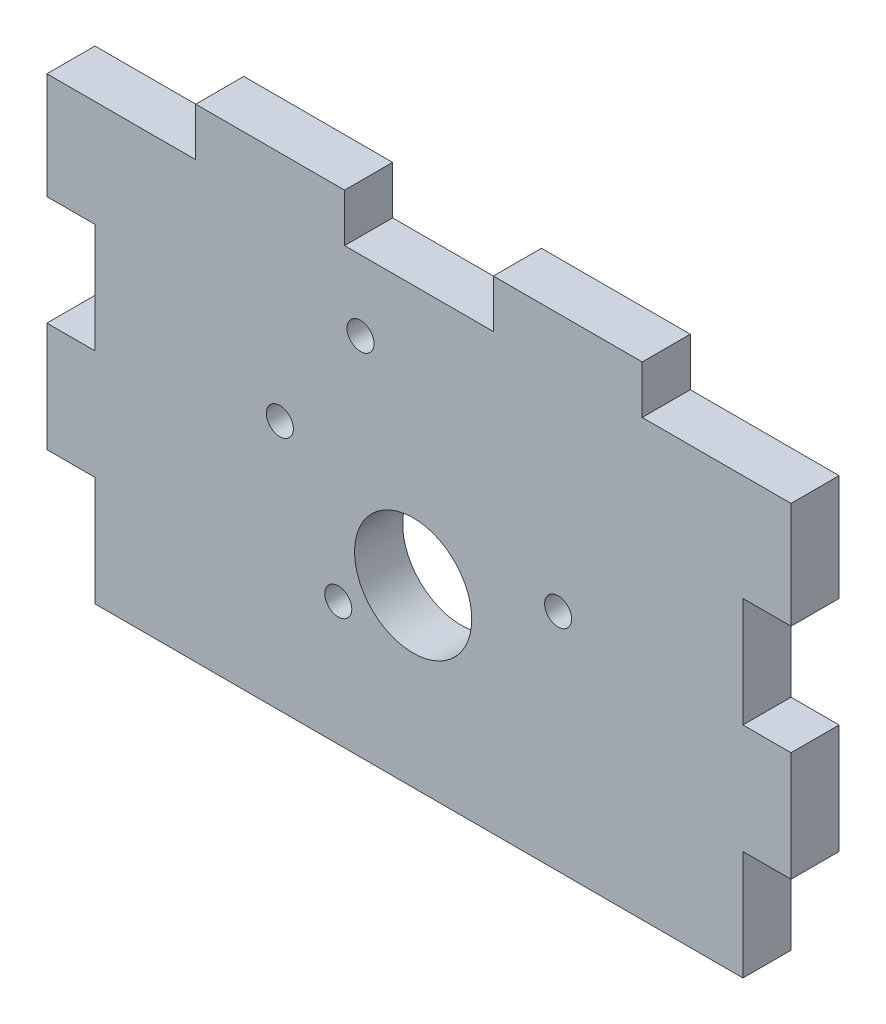
ISO-10303-21;
HEADER;
FILE_DESCRIPTION(('STEP AP214'),'2;1');
FILE_NAME('part.step','',(''),(''),'','','');
FILE_SCHEMA(('AUTOMOTIVE_DESIGN { 1 0 10303 214 1 1 1 1 }'));
ENDSEC;
DATA;
#1=APPLICATION_CONTEXT('core data for automotive mechanical design processes');
#2=APPLICATION_PROTOCOL_DEFINITION('international standard','automotive_design',2000,#1);
#3=PRODUCT_CONTEXT('',#1,'mechanical');
#4=PRODUCT('Part','Part','',(#3));
#5=PRODUCT_RELATED_PRODUCT_CATEGORY('part','',(#4));
#6=PRODUCT_DEFINITION_FORMATION('','',#4);
#7=PRODUCT_DEFINITION_CONTEXT('part definition',#1,'design');
#8=PRODUCT_DEFINITION('design','',#6,#7);
#9=PRODUCT_DEFINITION_SHAPE('','',#8);
#10=(LENGTH_UNIT() NAMED_UNIT(*) SI_UNIT(.MILLI.,.METRE.));
#11=(NAMED_UNIT(*) PLANE_ANGLE_UNIT() SI_UNIT($,.RADIAN.));
#12=(NAMED_UNIT(*) SI_UNIT($,.STERADIAN.) SOLID_ANGLE_UNIT());
#13=UNCERTAINTY_MEASURE_WITH_UNIT(LENGTH_MEASURE(1.E-05),#10,'distance_accuracy_value','');
#14=(GEOMETRIC_REPRESENTATION_CONTEXT(3) GLOBAL_UNCERTAINTY_ASSIGNED_CONTEXT((#13)) GLOBAL_UNIT_ASSIGNED_CONTEXT((#10,
#11,#12)) REPRESENTATION_CONTEXT('',''));
#15=CARTESIAN_POINT('',(0.,0.,0.));
#16=DIRECTION('',(0.,0.,1.));
#17=DIRECTION('',(1.,0.,0.));
#18=AXIS2_PLACEMENT_3D('',#15,#16,#17);
#19=CARTESIAN_POINT('',(-5.53524932452526,14.1108572179902,5.334));
#20=DIRECTION('',(-1.,0.,0.));
#21=DIRECTION('',(0.,0.,1.));
#22=AXIS2_PLACEMENT_3D('',#19,#20,#21);
#23=PLANE('',#22);
#24=DIRECTION('',(0.,1.,0.));
#25=VECTOR('',#24,1.);
#26=CARTESIAN_POINT('',(-5.53524932452526,14.1108572179902,5.334));
#27=LINE('',#26,#25);
#28=CARTESIAN_POINT('',(-5.53524932452527,-3.02097466689072,5.334));
#29=VERTEX_POINT('',#28);
#30=CARTESIAN_POINT('',(-5.53524932452526,8.77685721799016,5.334));
#31=VERTEX_POINT('',#30);
#32=EDGE_CURVE('E369',#29,#31,#27,.T.);
#33=ORIENTED_EDGE('',*,*,#32,.F.);
#34=DIRECTION('',(0.,0.,1.));
#35=VECTOR('',#34,1.);
#36=CARTESIAN_POINT('',(-5.53524932452527,-3.02097466689072,0.));
#37=LINE('',#36,#35);
#38=CARTESIAN_POINT('',(-5.53524932452527,-3.02097466689072,0.));
#39=VERTEX_POINT('',#38);
#40=EDGE_CURVE('E230',#39,#29,#37,.T.);
#41=ORIENTED_EDGE('',*,*,#40,.F.);
#42=DIRECTION('',(0.,1.,0.));
#43=VECTOR('',#42,1.);
#44=CARTESIAN_POINT('',(-5.53524932452526,14.1108572179902,0.));
#45=LINE('',#44,#43);
#46=CARTESIAN_POINT('',(-5.53524932452526,8.77685721799016,0.));
#47=VERTEX_POINT('',#46);
#48=EDGE_CURVE('E217',#39,#47,#45,.T.);
#49=ORIENTED_EDGE('',*,*,#48,.T.);
#50=DIRECTION('',(0.,0.,1.));
#51=VECTOR('',#50,1.);
#52=CARTESIAN_POINT('',(-5.53524932452526,8.77685721799016,0.));
#53=LINE('',#52,#51);
#54=EDGE_CURVE('E312',#47,#31,#53,.T.);
#55=ORIENTED_EDGE('',*,*,#54,.T.);
#56=EDGE_LOOP('',(#33,#41,#49,#55));
#57=FACE_BOUND('',#56,.T.);
#58=ADVANCED_FACE('F35',(#57),#23,.F.);
#59=CARTESIAN_POINT('',(-88.0852493245253,14.1108572179902,5.334));
#60=DIRECTION('',(1.,0.,0.));
#61=DIRECTION('',(0.,0.,-1.));
#62=AXIS2_PLACEMENT_3D('',#59,#60,#61);
#63=PLANE('',#62);
#64=DIRECTION('',(0.,-1.,0.));
#65=VECTOR('',#64,1.);
#66=CARTESIAN_POINT('',(-88.0852493245253,14.1108572179902,0.));
#67=LINE('',#66,#65);
#68=CARTESIAN_POINT('',(-88.0852493245253,8.77685721799016,0.));
#69=VERTEX_POINT('',#68);
#70=CARTESIAN_POINT('',(-88.0852493245253,-3.02097466689073,0.));
#71=VERTEX_POINT('',#70);
#72=EDGE_CURVE('E373',#69,#71,#67,.T.);
#73=ORIENTED_EDGE('',*,*,#72,.T.);
#74=DIRECTION('',(0.,0.,1.));
#75=VECTOR('',#74,1.);
#76=CARTESIAN_POINT('',(-88.0852493245253,-3.02097466689073,0.));
#77=LINE('',#76,#75);
#78=CARTESIAN_POINT('',(-88.0852493245253,-3.02097466689073,5.334));
#79=VERTEX_POINT('',#78);
#80=EDGE_CURVE('E270',#71,#79,#77,.T.);
#81=ORIENTED_EDGE('',*,*,#80,.T.);
#82=DIRECTION('',(0.,-1.,0.));
#83=VECTOR('',#82,1.);
#84=CARTESIAN_POINT('',(-88.0852493245253,14.1108572179902,5.334));
#85=LINE('',#84,#83);
#86=CARTESIAN_POINT('',(-88.0852493245253,8.77685721799016,5.334));
#87=VERTEX_POINT('',#86);
#88=EDGE_CURVE('E362',#87,#79,#85,.T.);
#89=ORIENTED_EDGE('',*,*,#88,.F.);
#90=DIRECTION('',(0.,0.,1.));
#91=VECTOR('',#90,1.);
#92=CARTESIAN_POINT('',(-88.0852493245253,8.77685721799016,0.));
#93=LINE('',#92,#91);
#94=EDGE_CURVE('E350',#69,#87,#93,.T.);
#95=ORIENTED_EDGE('',*,*,#94,.F.);
#96=EDGE_LOOP('',(#73,#81,#89,#95));
#97=FACE_BOUND('',#96,.T.);
#98=ADVANCED_FACE('F429',(#97),#63,.F.);
#99=CARTESIAN_POINT('',(-88.0852493245253,14.1108572179902,5.334));
#100=DIRECTION('',(0.,-1.,0.));
#101=DIRECTION('',(0.,0.,-1.));
#102=AXIS2_PLACEMENT_3D('',#99,#100,#101);
#103=PLANE('',#102);
#104=DIRECTION('',(-1.,0.,0.));
#105=VECTOR('',#104,1.);
#106=CARTESIAN_POINT('',(-88.0852493245253,14.1108572179902,5.334));
#107=LINE('',#106,#105);
#108=CARTESIAN_POINT('',(-55.0652493245253,14.1108572179902,5.334));
#109=VERTEX_POINT('',#108);
#110=CARTESIAN_POINT('',(-71.5752493245253,14.1108572179902,5.334));
#111=VERTEX_POINT('',#110);
#112=EDGE_CURVE('E44',#109,#111,#107,.T.);
#113=ORIENTED_EDGE('',*,*,#112,.F.);
#114=DIRECTION('',(0.,0.,1.));
#115=VECTOR('',#114,1.);
#116=CARTESIAN_POINT('',(-55.0652493245253,14.1108572179902,0.));
#117=LINE('',#116,#115);
#118=CARTESIAN_POINT('',(-55.0652493245253,14.1108572179902,0.));
#119=VERTEX_POINT('',#118);
#120=EDGE_CURVE('E334',#119,#109,#117,.T.);
#121=ORIENTED_EDGE('',*,*,#120,.F.);
#122=DIRECTION('',(-1.,0.,0.));
#123=VECTOR('',#122,1.);
#124=CARTESIAN_POINT('',(-88.0852493245253,14.1108572179902,0.));
#125=LINE('',#124,#123);
#126=CARTESIAN_POINT('',(-71.5752493245253,14.1108572179902,0.));
#127=VERTEX_POINT('',#126);
#128=EDGE_CURVE('E380',#119,#127,#125,.T.);
#129=ORIENTED_EDGE('',*,*,#128,.T.);
#130=DIRECTION('',(0.,0.,1.));
#131=VECTOR('',#130,1.);
#132=CARTESIAN_POINT('',(-71.5752493245253,14.1108572179902,0.));
#133=LINE('',#132,#131);
#134=EDGE_CURVE('E355',#127,#111,#133,.T.);
#135=ORIENTED_EDGE('',*,*,#134,.T.);
#136=EDGE_LOOP('',(#113,#121,#129,#135));
#137=FACE_BOUND('',#136,.T.);
#138=ADVANCED_FACE('F416',(#137),#103,.F.);
#139=CARTESIAN_POINT('',(-88.0852493245253,-15.1750307052638,5.334));
#140=VERTEX_POINT('',#139);
#141=CARTESIAN_POINT('',(-88.0852493245253,-27.3290867436368,5.334));
#142=VERTEX_POINT('',#141);
#143=EDGE_CURVE('E366',#140,#142,#85,.T.);
#144=ORIENTED_EDGE('',*,*,#143,.F.);
#145=DIRECTION('',(0.,0.,1.));
#146=VECTOR('',#145,1.);
#147=CARTESIAN_POINT('',(-88.0852493245253,-15.1750307052638,0.));
#148=LINE('',#147,#146);
#149=CARTESIAN_POINT('',(-88.0852493245253,-15.1750307052638,0.));
#150=VERTEX_POINT('',#149);
#151=EDGE_CURVE('E263',#150,#140,#148,.T.);
#152=ORIENTED_EDGE('',*,*,#151,.F.);
#153=CARTESIAN_POINT('',(-88.0852493245253,-27.3290867436368,0.));
#154=VERTEX_POINT('',#153);
#155=EDGE_CURVE('E358',#150,#154,#67,.T.);
#156=ORIENTED_EDGE('',*,*,#155,.T.);
#157=DIRECTION('',(0.,0.,1.));
#158=VECTOR('',#157,1.);
#159=CARTESIAN_POINT('',(-88.0852493245253,-27.3290867436368,0.));
#160=LINE('',#159,#158);
#161=EDGE_CURVE('E291',#154,#142,#160,.T.);
#162=ORIENTED_EDGE('',*,*,#161,.T.);
#163=EDGE_LOOP('',(#144,#152,#156,#162));
#164=FACE_BOUND('',#163,.T.);
#165=ADVANCED_FACE('F37',(#164),#63,.F.);
#166=CARTESIAN_POINT('',(-88.0852493245253,-39.4831427820098,5.334));
#167=DIRECTION('',(0.,1.,0.));
#168=DIRECTION('',(0.,0.,1.));
#169=AXIS2_PLACEMENT_3D('',#166,#167,#168);
#170=PLANE('',#169);
#171=DIRECTION('',(1.,0.,0.));
#172=VECTOR('',#171,1.);
#173=CARTESIAN_POINT('',(-88.0852493245253,-39.4831427820098,0.));
#174=LINE('',#173,#172);
#175=CARTESIAN_POINT('',(-82.7512493245253,-39.4831427820098,0.));
#176=VERTEX_POINT('',#175);
#177=CARTESIAN_POINT('',(-10.8692493245253,-39.4831427820098,0.));
#178=VERTEX_POINT('',#177);
#179=EDGE_CURVE('E376',#176,#178,#174,.T.);
#180=ORIENTED_EDGE('',*,*,#179,.T.);
#181=DIRECTION('',(0.,0.,1.));
#182=VECTOR('',#181,1.);
#183=CARTESIAN_POINT('',(-10.8692493245253,-39.4831427820098,0.));
#184=LINE('',#183,#182);
#185=CARTESIAN_POINT('',(-10.8692493245253,-39.4831427820098,5.334));
#186=VERTEX_POINT('',#185);
#187=EDGE_CURVE('E246',#178,#186,#184,.T.);
#188=ORIENTED_EDGE('',*,*,#187,.T.);
#189=DIRECTION('',(1.,0.,0.));
#190=VECTOR('',#189,1.);
#191=CARTESIAN_POINT('',(-88.0852493245253,-39.4831427820098,5.334));
#192=LINE('',#191,#190);
#193=CARTESIAN_POINT('',(-82.7512493245253,-39.4831427820098,5.334));
#194=VERTEX_POINT('',#193);
#195=EDGE_CURVE('E365',#194,#186,#192,.T.);
#196=ORIENTED_EDGE('',*,*,#195,.F.);
#197=DIRECTION('',(0.,0.,1.));
#198=VECTOR('',#197,1.);
#199=CARTESIAN_POINT('',(-82.7512493245253,-39.4831427820098,0.));
#200=LINE('',#199,#198);
#201=EDGE_CURVE('E286',#176,#194,#200,.T.);
#202=ORIENTED_EDGE('',*,*,#201,.F.);
#203=EDGE_LOOP('',(#180,#188,#196,#202));
#204=FACE_BOUND('',#203,.T.);
#205=ADVANCED_FACE('F457',(#204),#170,.F.);
#206=CARTESIAN_POINT('',(-5.53524932452526,-27.3290867436368,0.));
#207=VERTEX_POINT('',#206);
#208=CARTESIAN_POINT('',(-5.53524932452527,-15.1750307052638,0.));
#209=VERTEX_POINT('',#208);
#210=EDGE_CURVE('E378',#207,#209,#45,.T.);
#211=ORIENTED_EDGE('',*,*,#210,.T.);
#212=DIRECTION('',(0.,0.,1.));
#213=VECTOR('',#212,1.);
#214=CARTESIAN_POINT('',(-5.53524932452527,-15.1750307052638,0.));
#215=LINE('',#214,#213);
#216=CARTESIAN_POINT('',(-5.53524932452527,-15.1750307052638,5.334));
#217=VERTEX_POINT('',#216);
#218=EDGE_CURVE('E233',#209,#217,#215,.T.);
#219=ORIENTED_EDGE('',*,*,#218,.T.);
#220=CARTESIAN_POINT('',(-5.53524932452526,-27.3290867436368,5.334));
#221=VERTEX_POINT('',#220);
#222=EDGE_CURVE('E370',#221,#217,#27,.T.);
#223=ORIENTED_EDGE('',*,*,#222,.F.);
#224=DIRECTION('',(0.,0.,1.));
#225=VECTOR('',#224,1.);
#226=CARTESIAN_POINT('',(-5.53524932452526,-27.3290867436368,0.));
#227=LINE('',#226,#225);
#228=EDGE_CURVE('E242',#207,#221,#227,.T.);
#229=ORIENTED_EDGE('',*,*,#228,.F.);
#230=EDGE_LOOP('',(#211,#219,#223,#229));
#231=FACE_BOUND('',#230,.T.);
#232=ADVANCED_FACE('F464',(#231),#23,.F.);
#233=CARTESIAN_POINT('',(-22.0452493245253,14.1108572179902,5.334));
#234=VERTEX_POINT('',#233);
#235=CARTESIAN_POINT('',(-38.5552493245253,14.1108572179902,5.334));
#236=VERTEX_POINT('',#235);
#237=EDGE_CURVE('E11',#234,#236,#107,.T.);
#238=ORIENTED_EDGE('',*,*,#237,.F.);
#239=DIRECTION('',(0.,0.,1.));
#240=VECTOR('',#239,1.);
#241=CARTESIAN_POINT('',(-22.0452493245253,14.1108572179902,0.));
#242=LINE('',#241,#240);
#243=CARTESIAN_POINT('',(-22.0452493245253,14.1108572179902,0.));
#244=VERTEX_POINT('',#243);
#245=EDGE_CURVE('E309',#244,#234,#242,.T.);
#246=ORIENTED_EDGE('',*,*,#245,.F.);
#247=CARTESIAN_POINT('',(-38.5552493245253,14.1108572179902,0.));
#248=VERTEX_POINT('',#247);
#249=EDGE_CURVE('E39',#244,#248,#125,.T.);
#250=ORIENTED_EDGE('',*,*,#249,.T.);
#251=DIRECTION('',(0.,0.,1.));
#252=VECTOR('',#251,1.);
#253=CARTESIAN_POINT('',(-38.5552493245253,14.1108572179902,0.));
#254=LINE('',#253,#252);
#255=EDGE_CURVE('E337',#248,#236,#254,.T.);
#256=ORIENTED_EDGE('',*,*,#255,.T.);
#257=EDGE_LOOP('',(#238,#246,#250,#256));
#258=FACE_BOUND('',#257,.T.);
#259=ADVANCED_FACE('F398',(#258),#103,.F.);
#260=CARTESIAN_POINT('',(0.,0.,5.334));
#261=DIRECTION('',(0.,0.,1.));
#262=DIRECTION('',(1.,0.,0.));
#263=AXIS2_PLACEMENT_3D('',#260,#261,#262);
#264=PLANE('',#263);
#265=CARTESIAN_POINT('',(-47.4534551252633,-20.0629291628281,5.334));
#266=DIRECTION('',(0.,0.,1.));
#267=DIRECTION('',(1.,0.,0.));
#268=AXIS2_PLACEMENT_3D('',#265,#266,#267);
#269=CIRCLE('',#268,6.50000000000001);
#270=CARTESIAN_POINT('',(-40.9534551252633,-20.0629291628281,5.334));
#271=VERTEX_POINT('',#270);
#272=EDGE_CURVE('E625',#271,#271,#269,.T.);
#273=ORIENTED_EDGE('',*,*,#272,.F.);
#274=EDGE_LOOP('',(#273));
#275=FACE_BOUND('',#274,.T.);
#276=CARTESIAN_POINT('',(-31.3758223384276,-14.51678419793,5.334));
#277=DIRECTION('',(0.,0.,1.));
#278=DIRECTION('',(1.,0.,0.));
#279=AXIS2_PLACEMENT_3D('',#276,#277,#278);
#280=CIRCLE('',#279,1.49999999999997);
#281=CARTESIAN_POINT('',(-29.8758223384276,-14.51678419793,5.334));
#282=VERTEX_POINT('',#281);
#283=EDGE_CURVE('E627',#282,#282,#280,.T.);
#284=ORIENTED_EDGE('',*,*,#283,.F.);
#285=EDGE_LOOP('',(#284));
#286=FACE_BOUND('',#285,.T.);
#287=CARTESIAN_POINT('',(-53.2940335702651,0.986183788766913,5.334));
#288=DIRECTION('',(0.,0.,1.));
#289=DIRECTION('',(1.,0.,0.));
#290=AXIS2_PLACEMENT_3D('',#287,#288,#289);
#291=CIRCLE('',#290,1.49999999999988);
#292=CARTESIAN_POINT('',(-51.7940335702652,0.986183788766913,5.334));
#293=VERTEX_POINT('',#292);
#294=EDGE_CURVE('E633',#293,#293,#291,.T.);
#295=ORIENTED_EDGE('',*,*,#294,.F.);
#296=EDGE_LOOP('',(#295));
#297=FACE_BOUND('',#296,.T.);
#298=CARTESIAN_POINT('',(-55.7608920648827,-25.7470279368663,5.334));
#299=DIRECTION('',(0.,0.,1.));
#300=DIRECTION('',(1.,0.,0.));
#301=AXIS2_PLACEMENT_3D('',#298,#299,#300);
#302=CIRCLE('',#301,1.49999999999988);
#303=CARTESIAN_POINT('',(-54.2608920648828,-25.7470279368663,5.334));
#304=VERTEX_POINT('',#303);
#305=EDGE_CURVE('E639',#304,#304,#302,.T.);
#306=ORIENTED_EDGE('',*,*,#305,.F.);
#307=EDGE_LOOP('',(#306));
#308=FACE_BOUND('',#307,.T.);
#309=CARTESIAN_POINT('',(-62.2446763106228,-11.6683013660896,5.334));
#310=DIRECTION('',(0.,0.,1.));
#311=DIRECTION('',(1.,0.,0.));
#312=AXIS2_PLACEMENT_3D('',#309,#310,#311);
#313=CIRCLE('',#312,1.49999999999988);
#314=CARTESIAN_POINT('',(-60.7446763106229,-11.6683013660896,5.334));
#315=VERTEX_POINT('',#314);
#316=EDGE_CURVE('E223',#315,#315,#313,.T.);
#317=ORIENTED_EDGE('',*,*,#316,.F.);
#318=EDGE_LOOP('',(#317));
#319=FACE_BOUND('',#318,.T.);
#320=DIRECTION('',(-1.,0.,0.));
#321=VECTOR('',#320,1.);
#322=CARTESIAN_POINT('',(-5.53524932452527,-3.02097466689072,5.334));
#323=LINE('',#322,#321);
#324=CARTESIAN_POINT('',(-10.8692493245253,-3.02097466689072,5.334));
#325=VERTEX_POINT('',#324);
#326=EDGE_CURVE('E203',#29,#325,#323,.T.);
#327=ORIENTED_EDGE('',*,*,#326,.F.);
#328=ORIENTED_EDGE('',*,*,#32,.T.);
#329=DIRECTION('',(1.,0.,0.));
#330=VECTOR('',#329,1.);
#331=CARTESIAN_POINT('',(-22.0452493245253,8.77685721799016,5.334));
#332=LINE('',#331,#330);
#333=CARTESIAN_POINT('',(-22.0452493245253,8.77685721799016,5.334));
#334=VERTEX_POINT('',#333);
#335=EDGE_CURVE('E302',#334,#31,#332,.T.);
#336=ORIENTED_EDGE('',*,*,#335,.F.);
#337=DIRECTION('',(0.,-1.,0.));
#338=VECTOR('',#337,1.);
#339=CARTESIAN_POINT('',(-22.0452493245253,14.1108572179902,5.334));
#340=LINE('',#339,#338);
#341=EDGE_CURVE('E294',#234,#334,#340,.T.);
#342=ORIENTED_EDGE('',*,*,#341,.F.);
#343=ORIENTED_EDGE('',*,*,#237,.T.);
#344=DIRECTION('',(0.,1.,0.));
#345=VECTOR('',#344,1.);
#346=CARTESIAN_POINT('',(-38.5552493245253,14.1108572179902,5.334));
#347=LINE('',#346,#345);
#348=CARTESIAN_POINT('',(-38.5552493245253,8.77685721799016,5.334));
#349=VERTEX_POINT('',#348);
#350=EDGE_CURVE('E320',#349,#236,#347,.T.);
#351=ORIENTED_EDGE('',*,*,#350,.F.);
#352=DIRECTION('',(1.,0.,0.));
#353=VECTOR('',#352,1.);
#354=CARTESIAN_POINT('',(-55.0652493245253,8.77685721799016,5.334));
#355=LINE('',#354,#353);
#356=CARTESIAN_POINT('',(-55.0652493245253,8.77685721799016,5.334));
#357=VERTEX_POINT('',#356);
#358=EDGE_CURVE('E329',#357,#349,#355,.T.);
#359=ORIENTED_EDGE('',*,*,#358,.F.);
#360=DIRECTION('',(0.,-1.,0.));
#361=VECTOR('',#360,1.);
#362=CARTESIAN_POINT('',(-55.0652493245253,14.1108572179902,5.334));
#363=LINE('',#362,#361);
#364=EDGE_CURVE('E311',#109,#357,#363,.T.);
#365=ORIENTED_EDGE('',*,*,#364,.F.);
#366=ORIENTED_EDGE('',*,*,#112,.T.);
#367=DIRECTION('',(0.,1.,0.));
#368=VECTOR('',#367,1.);
#369=CARTESIAN_POINT('',(-71.5752493245253,14.1108572179902,5.334));
#370=LINE('',#369,#368);
#371=CARTESIAN_POINT('',(-71.5752493245253,8.77685721799016,5.334));
#372=VERTEX_POINT('',#371);
#373=EDGE_CURVE('E347',#372,#111,#370,.T.);
#374=ORIENTED_EDGE('',*,*,#373,.F.);
#375=DIRECTION('',(1.,0.,0.));
#376=VECTOR('',#375,1.);
#377=CARTESIAN_POINT('',(-88.0852493245253,8.77685721799016,5.334));
#378=LINE('',#377,#376);
#379=EDGE_CURVE('E336',#87,#372,#378,.T.);
#380=ORIENTED_EDGE('',*,*,#379,.F.);
#381=ORIENTED_EDGE('',*,*,#88,.T.);
#382=DIRECTION('',(-1.,0.,0.));
#383=VECTOR('',#382,1.);
#384=CARTESIAN_POINT('',(-88.0852493245253,-3.02097466689073,5.334));
#385=LINE('',#384,#383);
#386=CARTESIAN_POINT('',(-82.7512493245253,-3.02097466689073,5.334));
#387=VERTEX_POINT('',#386);
#388=EDGE_CURVE('E257',#387,#79,#385,.T.);
#389=ORIENTED_EDGE('',*,*,#388,.F.);
#390=DIRECTION('',(0.,1.,0.));
#391=VECTOR('',#390,1.);
#392=CARTESIAN_POINT('',(-82.7512493245253,-3.02097466689073,5.334));
#393=LINE('',#392,#391);
#394=CARTESIAN_POINT('',(-82.7512493245253,-15.1750307052638,5.334));
#395=VERTEX_POINT('',#394);
#396=EDGE_CURVE('E266',#395,#387,#393,.T.);
#397=ORIENTED_EDGE('',*,*,#396,.F.);
#398=DIRECTION('',(1.,0.,0.));
#399=VECTOR('',#398,1.);
#400=CARTESIAN_POINT('',(-88.0852493245253,-15.1750307052638,5.334));
#401=LINE('',#400,#399);
#402=EDGE_CURVE('E249',#140,#395,#401,.T.);
#403=ORIENTED_EDGE('',*,*,#402,.F.);
#404=ORIENTED_EDGE('',*,*,#143,.T.);
#405=DIRECTION('',(-1.,0.,0.));
#406=VECTOR('',#405,1.);
#407=CARTESIAN_POINT('',(-88.0852493245253,-27.3290867436368,5.334));
#408=LINE('',#407,#406);
#409=CARTESIAN_POINT('',(-82.7512493245253,-27.3290867436368,5.334));
#410=VERTEX_POINT('',#409);
#411=EDGE_CURVE('E283',#410,#142,#408,.T.);
#412=ORIENTED_EDGE('',*,*,#411,.F.);
#413=DIRECTION('',(0.,1.,0.));
#414=VECTOR('',#413,1.);
#415=CARTESIAN_POINT('',(-82.7512493245253,-39.4831427820098,5.334));
#416=LINE('',#415,#414);
#417=EDGE_CURVE('E273',#194,#410,#416,.T.);
#418=ORIENTED_EDGE('',*,*,#417,.F.);
#419=ORIENTED_EDGE('',*,*,#195,.T.);
#420=DIRECTION('',(0.,-1.,0.));
#421=VECTOR('',#420,1.);
#422=CARTESIAN_POINT('',(-10.8692493245253,-39.4831427820098,5.334));
#423=LINE('',#422,#421);
#424=CARTESIAN_POINT('',(-10.8692493245253,-27.3290867436368,5.334));
#425=VERTEX_POINT('',#424);
#426=EDGE_CURVE('E240',#425,#186,#423,.T.);
#427=ORIENTED_EDGE('',*,*,#426,.F.);
#428=DIRECTION('',(-1.,0.,0.));
#429=VECTOR('',#428,1.);
#430=CARTESIAN_POINT('',(-5.53524932452526,-27.3290867436368,5.334));
#431=LINE('',#430,#429);
#432=EDGE_CURVE('E232',#221,#425,#431,.T.);
#433=ORIENTED_EDGE('',*,*,#432,.F.);
#434=ORIENTED_EDGE('',*,*,#222,.T.);
#435=DIRECTION('',(1.,0.,0.));
#436=VECTOR('',#435,1.);
#437=CARTESIAN_POINT('',(-5.53524932452527,-15.1750307052638,5.334));
#438=LINE('',#437,#436);
#439=CARTESIAN_POINT('',(-10.8692493245253,-15.1750307052638,5.334));
#440=VERTEX_POINT('',#439);
#441=EDGE_CURVE('E218',#440,#217,#438,.T.);
#442=ORIENTED_EDGE('',*,*,#441,.F.);
#443=DIRECTION('',(0.,-1.,0.));
#444=VECTOR('',#443,1.);
#445=CARTESIAN_POINT('',(-10.8692493245253,-3.02097466689072,5.334));
#446=LINE('',#445,#444);
#447=EDGE_CURVE('E220',#325,#440,#446,.T.);
#448=ORIENTED_EDGE('',*,*,#447,.F.);
#449=EDGE_LOOP('',(#327,#328,#336,#342,#343,#351,#359,#365,#366,#374,#380,#381,#389,#397,#403,
#404,#412,#418,#419,#427,#433,#434,#442,#448));
#450=FACE_BOUND('',#449,.T.);
#451=ADVANCED_FACE('F402',(#275,#286,#297,#308,#319,#450),#264,.T.);
#452=CARTESIAN_POINT('',(0.,0.,0.));
#453=DIRECTION('',(0.,0.,1.));
#454=DIRECTION('',(1.,0.,0.));
#455=AXIS2_PLACEMENT_3D('',#452,#453,#454);
#456=PLANE('',#455);
#457=CARTESIAN_POINT('',(-47.4534551252633,-20.0629291628281,0.));
#458=DIRECTION('',(0.,0.,1.));
#459=DIRECTION('',(1.,0.,0.));
#460=AXIS2_PLACEMENT_3D('',#457,#458,#459);
#461=CIRCLE('',#460,6.50000000000001);
#462=CARTESIAN_POINT('',(-40.9534551252633,-20.0629291628281,0.));
#463=VERTEX_POINT('',#462);
#464=EDGE_CURVE('E622',#463,#463,#461,.T.);
#465=ORIENTED_EDGE('',*,*,#464,.T.);
#466=EDGE_LOOP('',(#465));
#467=FACE_BOUND('',#466,.T.);
#468=CARTESIAN_POINT('',(-31.3758223384276,-14.51678419793,0.));
#469=DIRECTION('',(0.,0.,1.));
#470=DIRECTION('',(1.,0.,0.));
#471=AXIS2_PLACEMENT_3D('',#468,#469,#470);
#472=CIRCLE('',#471,1.49999999999997);
#473=CARTESIAN_POINT('',(-29.8758223384276,-14.51678419793,0.));
#474=VERTEX_POINT('',#473);
#475=EDGE_CURVE('E630',#474,#474,#472,.T.);
#476=ORIENTED_EDGE('',*,*,#475,.T.);
#477=EDGE_LOOP('',(#476));
#478=FACE_BOUND('',#477,.T.);
#479=CARTESIAN_POINT('',(-53.2940335702651,0.986183788766913,0.));
#480=DIRECTION('',(0.,0.,1.));
#481=DIRECTION('',(1.,0.,0.));
#482=AXIS2_PLACEMENT_3D('',#479,#480,#481);
#483=CIRCLE('',#482,1.49999999999988);
#484=CARTESIAN_POINT('',(-51.7940335702652,0.986183788766913,0.));
#485=VERTEX_POINT('',#484);
#486=EDGE_CURVE('E636',#485,#485,#483,.T.);
#487=ORIENTED_EDGE('',*,*,#486,.T.);
#488=EDGE_LOOP('',(#487));
#489=FACE_BOUND('',#488,.T.);
#490=CARTESIAN_POINT('',(-55.7608920648827,-25.7470279368663,0.));
#491=DIRECTION('',(0.,0.,1.));
#492=DIRECTION('',(1.,0.,0.));
#493=AXIS2_PLACEMENT_3D('',#490,#491,#492);
#494=CIRCLE('',#493,1.49999999999988);
#495=CARTESIAN_POINT('',(-54.2608920648828,-25.7470279368663,0.));
#496=VERTEX_POINT('',#495);
#497=EDGE_CURVE('E642',#496,#496,#494,.T.);
#498=ORIENTED_EDGE('',*,*,#497,.T.);
#499=EDGE_LOOP('',(#498));
#500=FACE_BOUND('',#499,.T.);
#501=CARTESIAN_POINT('',(-62.2446763106228,-11.6683013660896,0.));
#502=DIRECTION('',(0.,0.,1.));
#503=DIRECTION('',(1.,0.,0.));
#504=AXIS2_PLACEMENT_3D('',#501,#502,#503);
#505=CIRCLE('',#504,1.49999999999988);
#506=CARTESIAN_POINT('',(-60.7446763106229,-11.6683013660896,0.));
#507=VERTEX_POINT('',#506);
#508=EDGE_CURVE('E228',#507,#507,#505,.T.);
#509=ORIENTED_EDGE('',*,*,#508,.T.);
#510=EDGE_LOOP('',(#509));
#511=FACE_BOUND('',#510,.T.);
#512=ORIENTED_EDGE('',*,*,#48,.F.);
#513=DIRECTION('',(-1.,0.,0.));
#514=VECTOR('',#513,1.);
#515=CARTESIAN_POINT('',(-5.53524932452527,-3.02097466689072,0.));
#516=LINE('',#515,#514);
#517=CARTESIAN_POINT('',(-10.8692493245253,-3.02097466689072,0.));
#518=VERTEX_POINT('',#517);
#519=EDGE_CURVE('E200',#39,#518,#516,.T.);
#520=ORIENTED_EDGE('',*,*,#519,.T.);
#521=DIRECTION('',(0.,-1.,0.));
#522=VECTOR('',#521,1.);
#523=CARTESIAN_POINT('',(-10.8692493245253,-3.02097466689072,0.));
#524=LINE('',#523,#522);
#525=CARTESIAN_POINT('',(-10.8692493245253,-15.1750307052638,0.));
#526=VERTEX_POINT('',#525);
#527=EDGE_CURVE('E210',#518,#526,#524,.T.);
#528=ORIENTED_EDGE('',*,*,#527,.T.);
#529=DIRECTION('',(1.,0.,0.));
#530=VECTOR('',#529,1.);
#531=CARTESIAN_POINT('',(-5.53524932452527,-15.1750307052638,0.));
#532=LINE('',#531,#530);
#533=EDGE_CURVE('E52',#526,#209,#532,.T.);
#534=ORIENTED_EDGE('',*,*,#533,.T.);
#535=ORIENTED_EDGE('',*,*,#210,.F.);
#536=DIRECTION('',(-1.,0.,0.));
#537=VECTOR('',#536,1.);
#538=CARTESIAN_POINT('',(-5.53524932452526,-27.3290867436368,0.));
#539=LINE('',#538,#537);
#540=CARTESIAN_POINT('',(-10.8692493245253,-27.3290867436368,0.));
#541=VERTEX_POINT('',#540);
#542=EDGE_CURVE('E237',#207,#541,#539,.T.);
#543=ORIENTED_EDGE('',*,*,#542,.T.);
#544=DIRECTION('',(0.,-1.,0.));
#545=VECTOR('',#544,1.);
#546=CARTESIAN_POINT('',(-10.8692493245253,-39.4831427820098,0.));
#547=LINE('',#546,#545);
#548=EDGE_CURVE('E60',#541,#178,#547,.T.);
#549=ORIENTED_EDGE('',*,*,#548,.T.);
#550=ORIENTED_EDGE('',*,*,#179,.F.);
#551=DIRECTION('',(0.,1.,0.));
#552=VECTOR('',#551,1.);
#553=CARTESIAN_POINT('',(-82.7512493245253,-39.4831427820098,0.));
#554=LINE('',#553,#552);
#555=CARTESIAN_POINT('',(-82.7512493245253,-27.3290867436368,0.));
#556=VERTEX_POINT('',#555);
#557=EDGE_CURVE('E279',#176,#556,#554,.T.);
#558=ORIENTED_EDGE('',*,*,#557,.T.);
#559=DIRECTION('',(-1.,0.,0.));
#560=VECTOR('',#559,1.);
#561=CARTESIAN_POINT('',(-88.0852493245253,-27.3290867436368,0.));
#562=LINE('',#561,#560);
#563=EDGE_CURVE('E282',#556,#154,#562,.T.);
#564=ORIENTED_EDGE('',*,*,#563,.T.);
#565=ORIENTED_EDGE('',*,*,#155,.F.);
#566=DIRECTION('',(1.,0.,0.));
#567=VECTOR('',#566,1.);
#568=CARTESIAN_POINT('',(-88.0852493245253,-15.1750307052638,0.));
#569=LINE('',#568,#567);
#570=CARTESIAN_POINT('',(-82.7512493245253,-15.1750307052638,0.));
#571=VERTEX_POINT('',#570);
#572=EDGE_CURVE('E253',#150,#571,#569,.T.);
#573=ORIENTED_EDGE('',*,*,#572,.T.);
#574=DIRECTION('',(0.,1.,0.));
#575=VECTOR('',#574,1.);
#576=CARTESIAN_POINT('',(-82.7512493245253,-3.02097466689073,0.));
#577=LINE('',#576,#575);
#578=CARTESIAN_POINT('',(-82.7512493245253,-3.02097466689073,0.));
#579=VERTEX_POINT('',#578);
#580=EDGE_CURVE('E256',#571,#579,#577,.T.);
#581=ORIENTED_EDGE('',*,*,#580,.T.);
#582=DIRECTION('',(-1.,0.,0.));
#583=VECTOR('',#582,1.);
#584=CARTESIAN_POINT('',(-88.0852493245253,-3.02097466689073,0.));
#585=LINE('',#584,#583);
#586=EDGE_CURVE('E260',#579,#71,#585,.T.);
#587=ORIENTED_EDGE('',*,*,#586,.T.);
#588=ORIENTED_EDGE('',*,*,#72,.F.);
#589=DIRECTION('',(1.,0.,0.));
#590=VECTOR('',#589,1.);
#591=CARTESIAN_POINT('',(-88.0852493245253,8.77685721799016,0.));
#592=LINE('',#591,#590);
#593=CARTESIAN_POINT('',(-71.5752493245253,8.77685721799016,0.));
#594=VERTEX_POINT('',#593);
#595=EDGE_CURVE('E343',#69,#594,#592,.T.);
#596=ORIENTED_EDGE('',*,*,#595,.T.);
#597=DIRECTION('',(0.,1.,0.));
#598=VECTOR('',#597,1.);
#599=CARTESIAN_POINT('',(-71.5752493245253,14.1108572179902,0.));
#600=LINE('',#599,#598);
#601=EDGE_CURVE('E346',#594,#127,#600,.T.);
#602=ORIENTED_EDGE('',*,*,#601,.T.);
#603=ORIENTED_EDGE('',*,*,#128,.F.);
#604=DIRECTION('',(0.,-1.,0.));
#605=VECTOR('',#604,1.);
#606=CARTESIAN_POINT('',(-55.0652493245253,14.1108572179902,0.));
#607=LINE('',#606,#605);
#608=CARTESIAN_POINT('',(-55.0652493245253,8.77685721799016,0.));
#609=VERTEX_POINT('',#608);
#610=EDGE_CURVE('E316',#119,#609,#607,.T.);
#611=ORIENTED_EDGE('',*,*,#610,.T.);
#612=DIRECTION('',(1.,0.,0.));
#613=VECTOR('',#612,1.);
#614=CARTESIAN_POINT('',(-55.0652493245253,8.77685721799016,0.));
#615=LINE('',#614,#613);
#616=CARTESIAN_POINT('',(-38.5552493245253,8.77685721799016,0.));
#617=VERTEX_POINT('',#616);
#618=EDGE_CURVE('E319',#609,#617,#615,.T.);
#619=ORIENTED_EDGE('',*,*,#618,.T.);
#620=DIRECTION('',(0.,1.,0.));
#621=VECTOR('',#620,1.);
#622=CARTESIAN_POINT('',(-38.5552493245253,14.1108572179902,0.));
#623=LINE('',#622,#621);
#624=EDGE_CURVE('E323',#617,#248,#623,.T.);
#625=ORIENTED_EDGE('',*,*,#624,.T.);
#626=ORIENTED_EDGE('',*,*,#249,.F.);
#627=DIRECTION('',(0.,-1.,0.));
#628=VECTOR('',#627,1.);
#629=CARTESIAN_POINT('',(-22.0452493245253,14.1108572179902,0.));
#630=LINE('',#629,#628);
#631=CARTESIAN_POINT('',(-22.0452493245253,8.77685721799016,0.));
#632=VERTEX_POINT('',#631);
#633=EDGE_CURVE('E298',#244,#632,#630,.T.);
#634=ORIENTED_EDGE('',*,*,#633,.T.);
#635=DIRECTION('',(1.,0.,0.));
#636=VECTOR('',#635,1.);
#637=CARTESIAN_POINT('',(-22.0452493245253,8.77685721799016,0.));
#638=LINE('',#637,#636);
#639=EDGE_CURVE('E301',#632,#47,#638,.T.);
#640=ORIENTED_EDGE('',*,*,#639,.T.);
#641=EDGE_LOOP('',(#512,#520,#528,#534,#535,#543,#549,#550,#558,#564,#565,#573,#581,#587,#588,
#596,#602,#603,#611,#619,#625,#626,#634,#640));
#642=FACE_BOUND('',#641,.T.);
#643=ADVANCED_FACE('F215',(#467,#478,#489,#500,#511,#642),#456,.F.);
#644=CARTESIAN_POINT('',(-71.5752493245253,14.1108572179902,0.));
#645=DIRECTION('',(1.,0.,0.));
#646=DIRECTION('',(0.,0.,-1.));
#647=AXIS2_PLACEMENT_3D('',#644,#645,#646);
#648=PLANE('',#647);
#649=ORIENTED_EDGE('',*,*,#373,.T.);
#650=ORIENTED_EDGE('',*,*,#134,.F.);
#651=ORIENTED_EDGE('',*,*,#601,.F.);
#652=DIRECTION('',(0.,0.,1.));
#653=VECTOR('',#652,1.);
#654=CARTESIAN_POINT('',(-71.5752493245253,8.77685721799016,0.));
#655=LINE('',#654,#653);
#656=EDGE_CURVE('E359',#594,#372,#655,.T.);
#657=ORIENTED_EDGE('',*,*,#656,.T.);
#658=EDGE_LOOP('',(#649,#650,#651,#657));
#659=FACE_BOUND('',#658,.T.);
#660=ADVANCED_FACE('F420',(#659),#648,.F.);
#661=CARTESIAN_POINT('',(-88.0852493245253,8.77685721799016,0.));
#662=DIRECTION('',(0.,-1.,0.));
#663=DIRECTION('',(0.,0.,-1.));
#664=AXIS2_PLACEMENT_3D('',#661,#662,#663);
#665=PLANE('',#664);
#666=ORIENTED_EDGE('',*,*,#379,.T.);
#667=ORIENTED_EDGE('',*,*,#656,.F.);
#668=ORIENTED_EDGE('',*,*,#595,.F.);
#669=ORIENTED_EDGE('',*,*,#94,.T.);
#670=EDGE_LOOP('',(#666,#667,#668,#669));
#671=FACE_BOUND('',#670,.T.);
#672=ADVANCED_FACE('F425',(#671),#665,.F.);
#673=CARTESIAN_POINT('',(-55.0652493245253,14.1108572179902,0.));
#674=DIRECTION('',(-1.,0.,0.));
#675=DIRECTION('',(0.,0.,1.));
#676=AXIS2_PLACEMENT_3D('',#673,#674,#675);
#677=PLANE('',#676);
#678=ORIENTED_EDGE('',*,*,#364,.T.);
#679=DIRECTION('',(0.,0.,1.));
#680=VECTOR('',#679,1.);
#681=CARTESIAN_POINT('',(-55.0652493245253,8.77685721799016,0.));
#682=LINE('',#681,#680);
#683=EDGE_CURVE('E326',#609,#357,#682,.T.);
#684=ORIENTED_EDGE('',*,*,#683,.F.);
#685=ORIENTED_EDGE('',*,*,#610,.F.);
#686=ORIENTED_EDGE('',*,*,#120,.T.);
#687=EDGE_LOOP('',(#678,#684,#685,#686));
#688=FACE_BOUND('',#687,.T.);
#689=ADVANCED_FACE('F505',(#688),#677,.F.);
#690=CARTESIAN_POINT('',(-38.5552493245253,14.1108572179902,0.));
#691=DIRECTION('',(1.,0.,0.));
#692=DIRECTION('',(0.,0.,-1.));
#693=AXIS2_PLACEMENT_3D('',#690,#691,#692);
#694=PLANE('',#693);
#695=ORIENTED_EDGE('',*,*,#350,.T.);
#696=ORIENTED_EDGE('',*,*,#255,.F.);
#697=ORIENTED_EDGE('',*,*,#624,.F.);
#698=DIRECTION('',(0.,0.,1.));
#699=VECTOR('',#698,1.);
#700=CARTESIAN_POINT('',(-38.5552493245253,8.77685721799016,0.));
#701=LINE('',#700,#699);
#702=EDGE_CURVE('E340',#617,#349,#701,.T.);
#703=ORIENTED_EDGE('',*,*,#702,.T.);
#704=EDGE_LOOP('',(#695,#696,#697,#703));
#705=FACE_BOUND('',#704,.T.);
#706=ADVANCED_FACE('F405',(#705),#694,.F.);
#707=CARTESIAN_POINT('',(-55.0652493245253,8.77685721799016,0.));
#708=DIRECTION('',(0.,-1.,0.));
#709=DIRECTION('',(0.,0.,-1.));
#710=AXIS2_PLACEMENT_3D('',#707,#708,#709);
#711=PLANE('',#710);
#712=ORIENTED_EDGE('',*,*,#358,.T.);
#713=ORIENTED_EDGE('',*,*,#702,.F.);
#714=ORIENTED_EDGE('',*,*,#618,.F.);
#715=ORIENTED_EDGE('',*,*,#683,.T.);
#716=EDGE_LOOP('',(#712,#713,#714,#715));
#717=FACE_BOUND('',#716,.T.);
#718=ADVANCED_FACE('F409',(#717),#711,.F.);
#719=CARTESIAN_POINT('',(-22.0452493245253,14.1108572179902,0.));
#720=DIRECTION('',(-1.,0.,0.));
#721=DIRECTION('',(0.,0.,1.));
#722=AXIS2_PLACEMENT_3D('',#719,#720,#721);
#723=PLANE('',#722);
#724=ORIENTED_EDGE('',*,*,#341,.T.);
#725=DIRECTION('',(0.,0.,1.));
#726=VECTOR('',#725,1.);
#727=CARTESIAN_POINT('',(-22.0452493245253,8.77685721799016,0.));
#728=LINE('',#727,#726);
#729=EDGE_CURVE('E304',#632,#334,#728,.T.);
#730=ORIENTED_EDGE('',*,*,#729,.F.);
#731=ORIENTED_EDGE('',*,*,#633,.F.);
#732=ORIENTED_EDGE('',*,*,#245,.T.);
#733=EDGE_LOOP('',(#724,#730,#731,#732));
#734=FACE_BOUND('',#733,.T.);
#735=ADVANCED_FACE('F394',(#734),#723,.F.);
#736=CARTESIAN_POINT('',(-22.0452493245253,8.77685721799016,0.));
#737=DIRECTION('',(0.,-1.,0.));
#738=DIRECTION('',(0.,0.,-1.));
#739=AXIS2_PLACEMENT_3D('',#736,#737,#738);
#740=PLANE('',#739);
#741=ORIENTED_EDGE('',*,*,#335,.T.);
#742=ORIENTED_EDGE('',*,*,#54,.F.);
#743=ORIENTED_EDGE('',*,*,#639,.F.);
#744=ORIENTED_EDGE('',*,*,#729,.T.);
#745=EDGE_LOOP('',(#741,#742,#743,#744));
#746=FACE_BOUND('',#745,.T.);
#747=ADVANCED_FACE('F389',(#746),#740,.F.);
#748=CARTESIAN_POINT('',(-88.0852493245253,-27.3290867436368,0.));
#749=DIRECTION('',(0.,1.,0.));
#750=DIRECTION('',(0.,0.,1.));
#751=AXIS2_PLACEMENT_3D('',#748,#749,#750);
#752=PLANE('',#751);
#753=ORIENTED_EDGE('',*,*,#411,.T.);
#754=ORIENTED_EDGE('',*,*,#161,.F.);
#755=ORIENTED_EDGE('',*,*,#563,.F.);
#756=DIRECTION('',(0.,0.,1.));
#757=VECTOR('',#756,1.);
#758=CARTESIAN_POINT('',(-82.7512493245253,-27.3290867436368,0.));
#759=LINE('',#758,#757);
#760=EDGE_CURVE('E295',#556,#410,#759,.T.);
#761=ORIENTED_EDGE('',*,*,#760,.T.);
#762=EDGE_LOOP('',(#753,#754,#755,#761));
#763=FACE_BOUND('',#762,.T.);
#764=ADVANCED_FACE('F448',(#763),#752,.F.);
#765=CARTESIAN_POINT('',(-82.7512493245253,-39.4831427820098,0.));
#766=DIRECTION('',(1.,0.,0.));
#767=DIRECTION('',(0.,0.,-1.));
#768=AXIS2_PLACEMENT_3D('',#765,#766,#767);
#769=PLANE('',#768);
#770=ORIENTED_EDGE('',*,*,#417,.T.);
#771=ORIENTED_EDGE('',*,*,#760,.F.);
#772=ORIENTED_EDGE('',*,*,#557,.F.);
#773=ORIENTED_EDGE('',*,*,#201,.T.);
#774=EDGE_LOOP('',(#770,#771,#772,#773));
#775=FACE_BOUND('',#774,.T.);
#776=ADVANCED_FACE('F453',(#775),#769,.F.);
#777=CARTESIAN_POINT('',(-88.0852493245253,-3.02097466689073,0.));
#778=DIRECTION('',(0.,1.,0.));
#779=DIRECTION('',(-1.,0.,0.));
#780=AXIS2_PLACEMENT_3D('',#777,#778,#779);
#781=PLANE('',#780);
#782=ORIENTED_EDGE('',*,*,#388,.T.);
#783=ORIENTED_EDGE('',*,*,#80,.F.);
#784=ORIENTED_EDGE('',*,*,#586,.F.);
#785=DIRECTION('',(0.,0.,1.));
#786=VECTOR('',#785,1.);
#787=CARTESIAN_POINT('',(-82.7512493245253,-3.02097466689073,0.));
#788=LINE('',#787,#786);
#789=EDGE_CURVE('E274',#579,#387,#788,.T.);
#790=ORIENTED_EDGE('',*,*,#789,.T.);
#791=EDGE_LOOP('',(#782,#783,#784,#790));
#792=FACE_BOUND('',#791,.T.);
#793=ADVANCED_FACE('F434',(#792),#781,.F.);
#794=CARTESIAN_POINT('',(-82.7512493245253,-3.02097466689073,0.));
#795=DIRECTION('',(1.,0.,0.));
#796=DIRECTION('',(0.,0.,-1.));
#797=AXIS2_PLACEMENT_3D('',#794,#795,#796);
#798=PLANE('',#797);
#799=ORIENTED_EDGE('',*,*,#396,.T.);
#800=ORIENTED_EDGE('',*,*,#789,.F.);
#801=ORIENTED_EDGE('',*,*,#580,.F.);
#802=DIRECTION('',(0.,0.,1.));
#803=VECTOR('',#802,1.);
#804=CARTESIAN_POINT('',(-82.7512493245253,-15.1750307052638,0.));
#805=LINE('',#804,#803);
#806=EDGE_CURVE('E276',#571,#395,#805,.T.);
#807=ORIENTED_EDGE('',*,*,#806,.T.);
#808=EDGE_LOOP('',(#799,#800,#801,#807));
#809=FACE_BOUND('',#808,.T.);
#810=ADVANCED_FACE('F437',(#809),#798,.F.);
#811=CARTESIAN_POINT('',(-88.0852493245253,-15.1750307052638,0.));
#812=DIRECTION('',(0.,-1.,0.));
#813=DIRECTION('',(0.,0.,-1.));
#814=AXIS2_PLACEMENT_3D('',#811,#812,#813);
#815=PLANE('',#814);
#816=ORIENTED_EDGE('',*,*,#402,.T.);
#817=ORIENTED_EDGE('',*,*,#806,.F.);
#818=ORIENTED_EDGE('',*,*,#572,.F.);
#819=ORIENTED_EDGE('',*,*,#151,.T.);
#820=EDGE_LOOP('',(#816,#817,#818,#819));
#821=FACE_BOUND('',#820,.T.);
#822=ADVANCED_FACE('F440',(#821),#815,.F.);
#823=CARTESIAN_POINT('',(-10.8692493245253,-39.4831427820098,0.));
#824=DIRECTION('',(-1.,0.,0.));
#825=DIRECTION('',(0.,0.,1.));
#826=AXIS2_PLACEMENT_3D('',#823,#824,#825);
#827=PLANE('',#826);
#828=ORIENTED_EDGE('',*,*,#426,.T.);
#829=ORIENTED_EDGE('',*,*,#187,.F.);
#830=ORIENTED_EDGE('',*,*,#548,.F.);
#831=DIRECTION('',(0.,0.,1.));
#832=VECTOR('',#831,1.);
#833=CARTESIAN_POINT('',(-10.8692493245253,-27.3290867436368,0.));
#834=LINE('',#833,#832);
#835=EDGE_CURVE('E250',#541,#425,#834,.T.);
#836=ORIENTED_EDGE('',*,*,#835,.T.);
#837=EDGE_LOOP('',(#828,#829,#830,#836));
#838=FACE_BOUND('',#837,.T.);
#839=ADVANCED_FACE('F461',(#838),#827,.F.);
#840=CARTESIAN_POINT('',(-5.53524932452526,-27.3290867436368,0.));
#841=DIRECTION('',(0.,1.,0.));
#842=DIRECTION('',(0.,0.,1.));
#843=AXIS2_PLACEMENT_3D('',#840,#841,#842);
#844=PLANE('',#843);
#845=ORIENTED_EDGE('',*,*,#432,.T.);
#846=ORIENTED_EDGE('',*,*,#835,.F.);
#847=ORIENTED_EDGE('',*,*,#542,.F.);
#848=ORIENTED_EDGE('',*,*,#228,.T.);
#849=EDGE_LOOP('',(#845,#846,#847,#848));
#850=FACE_BOUND('',#849,.T.);
#851=ADVANCED_FACE('F463',(#850),#844,.F.);
#852=CARTESIAN_POINT('',(-5.53524932452527,-3.02097466689072,0.));
#853=DIRECTION('',(0.,1.,0.));
#854=DIRECTION('',(-1.,0.,0.));
#855=AXIS2_PLACEMENT_3D('',#852,#853,#854);
#856=PLANE('',#855);
#857=ORIENTED_EDGE('',*,*,#326,.T.);
#858=DIRECTION('',(0.,0.,1.));
#859=VECTOR('',#858,1.);
#860=CARTESIAN_POINT('',(-10.8692493245253,-3.02097466689072,0.));
#861=LINE('',#860,#859);
#862=EDGE_CURVE('E196',#518,#325,#861,.T.);
#863=ORIENTED_EDGE('',*,*,#862,.F.);
#864=ORIENTED_EDGE('',*,*,#519,.F.);
#865=ORIENTED_EDGE('',*,*,#40,.T.);
#866=EDGE_LOOP('',(#857,#863,#864,#865));
#867=FACE_BOUND('',#866,.T.);
#868=ADVANCED_FACE('F198',(#867),#856,.F.);
#869=CARTESIAN_POINT('',(-5.53524932452527,-15.1750307052638,0.));
#870=DIRECTION('',(0.,-1.,0.));
#871=DIRECTION('',(1.,0.,0.));
#872=AXIS2_PLACEMENT_3D('',#869,#870,#871);
#873=PLANE('',#872);
#874=ORIENTED_EDGE('',*,*,#441,.T.);
#875=ORIENTED_EDGE('',*,*,#218,.F.);
#876=ORIENTED_EDGE('',*,*,#533,.F.);
#877=DIRECTION('',(0.,0.,1.));
#878=VECTOR('',#877,1.);
#879=CARTESIAN_POINT('',(-10.8692493245253,-15.1750307052638,0.));
#880=LINE('',#879,#878);
#881=EDGE_CURVE('E207',#526,#440,#880,.T.);
#882=ORIENTED_EDGE('',*,*,#881,.T.);
#883=EDGE_LOOP('',(#874,#875,#876,#882));
#884=FACE_BOUND('',#883,.T.);
#885=ADVANCED_FACE('F466',(#884),#873,.F.);
#886=CARTESIAN_POINT('',(-10.8692493245253,-3.02097466689072,0.));
#887=DIRECTION('',(-1.,0.,0.));
#888=DIRECTION('',(0.,0.,1.));
#889=AXIS2_PLACEMENT_3D('',#886,#887,#888);
#890=PLANE('',#889);
#891=ORIENTED_EDGE('',*,*,#447,.T.);
#892=ORIENTED_EDGE('',*,*,#881,.F.);
#893=ORIENTED_EDGE('',*,*,#527,.F.);
#894=ORIENTED_EDGE('',*,*,#862,.T.);
#895=EDGE_LOOP('',(#891,#892,#893,#894));
#896=FACE_BOUND('',#895,.T.);
#897=ADVANCED_FACE('F211',(#896),#890,.F.);
#898=CARTESIAN_POINT('',(-62.2446763106228,-11.6683013660896,0.));
#899=DIRECTION('',(0.,0.,1.));
#900=DIRECTION('',(1.,0.,0.));
#901=AXIS2_PLACEMENT_3D('',#898,#899,#900);
#902=CYLINDRICAL_SURFACE('',#901,1.49999999999988);
#903=ORIENTED_EDGE('',*,*,#508,.F.);
#904=EDGE_LOOP('',(#903));
#905=FACE_BOUND('',#904,.T.);
#906=ORIENTED_EDGE('',*,*,#316,.T.);
#907=EDGE_LOOP('',(#906));
#908=FACE_BOUND('',#907,.T.);
#909=ADVANCED_FACE('F473',(#905,#908),#902,.F.);
#910=CARTESIAN_POINT('',(-55.7608920648827,-25.7470279368663,0.));
#911=DIRECTION('',(0.,0.,1.));
#912=DIRECTION('',(1.,0.,0.));
#913=AXIS2_PLACEMENT_3D('',#910,#911,#912);
#914=CYLINDRICAL_SURFACE('',#913,1.49999999999988);
#915=ORIENTED_EDGE('',*,*,#497,.F.);
#916=EDGE_LOOP('',(#915));
#917=FACE_BOUND('',#916,.T.);
#918=ORIENTED_EDGE('',*,*,#305,.T.);
#919=EDGE_LOOP('',(#918));
#920=FACE_BOUND('',#919,.T.);
#921=ADVANCED_FACE('F576',(#917,#920),#914,.F.);
#922=CARTESIAN_POINT('',(-53.2940335702651,0.986183788766913,0.));
#923=DIRECTION('',(0.,0.,1.));
#924=DIRECTION('',(1.,0.,0.));
#925=AXIS2_PLACEMENT_3D('',#922,#923,#924);
#926=CYLINDRICAL_SURFACE('',#925,1.49999999999988);
#927=ORIENTED_EDGE('',*,*,#486,.F.);
#928=EDGE_LOOP('',(#927));
#929=FACE_BOUND('',#928,.T.);
#930=ORIENTED_EDGE('',*,*,#294,.T.);
#931=EDGE_LOOP('',(#930));
#932=FACE_BOUND('',#931,.T.);
#933=ADVANCED_FACE('F585',(#929,#932),#926,.F.);
#934=CARTESIAN_POINT('',(-31.3758223384276,-14.51678419793,0.));
#935=DIRECTION('',(0.,0.,1.));
#936=DIRECTION('',(1.,0.,0.));
#937=AXIS2_PLACEMENT_3D('',#934,#935,#936);
#938=CYLINDRICAL_SURFACE('',#937,1.49999999999997);
#939=ORIENTED_EDGE('',*,*,#475,.F.);
#940=EDGE_LOOP('',(#939));
#941=FACE_BOUND('',#940,.T.);
#942=ORIENTED_EDGE('',*,*,#283,.T.);
#943=EDGE_LOOP('',(#942));
#944=FACE_BOUND('',#943,.T.);
#945=ADVANCED_FACE('F595',(#941,#944),#938,.F.);
#946=CARTESIAN_POINT('',(-47.4534551252633,-20.0629291628281,0.));
#947=DIRECTION('',(0.,0.,1.));
#948=DIRECTION('',(1.,0.,0.));
#949=AXIS2_PLACEMENT_3D('',#946,#947,#948);
#950=CYLINDRICAL_SURFACE('',#949,6.50000000000001);
#951=ORIENTED_EDGE('',*,*,#464,.F.);
#952=EDGE_LOOP('',(#951));
#953=FACE_BOUND('',#952,.T.);
#954=ORIENTED_EDGE('',*,*,#272,.T.);
#955=EDGE_LOOP('',(#954));
#956=FACE_BOUND('',#955,.T.);
#957=ADVANCED_FACE('F605',(#953,#956),#950,.F.);
#958=CLOSED_SHELL('',(#58,#98,#138,#165,#205,#232,#259,#451,#643,#660,#672,#689,#706,#718,#735,
#747,#764,#776,#793,#810,#822,#839,#851,#868,#885,#897,#909,#921,#933,#945,#957));
#959=MANIFOLD_SOLID_BREP('B2',#958);
#960=ADVANCED_BREP_SHAPE_REPRESENTATION('',(#18,#959),#14);
#961=SHAPE_DEFINITION_REPRESENTATION(#9,#960);
ENDSEC;
END-ISO-10303-21;
